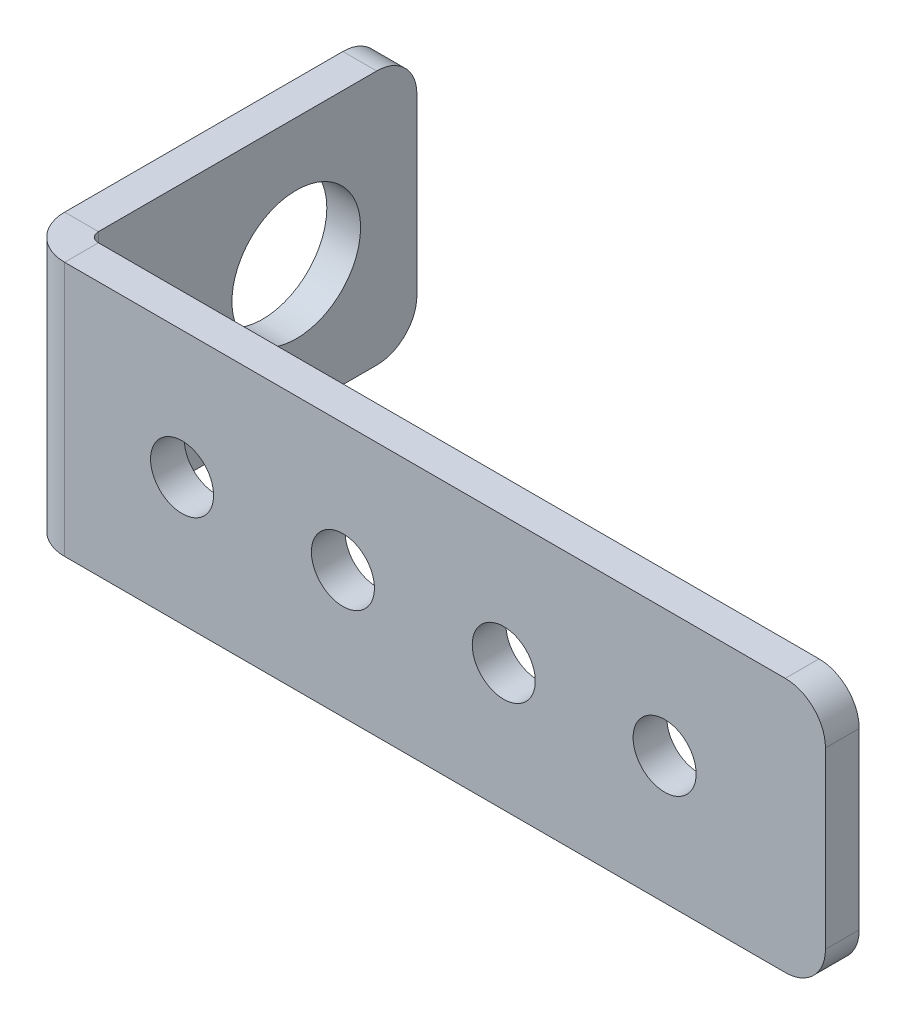
ISO-10303-21;
HEADER;
FILE_DESCRIPTION(('STEP AP214'),'2;1');
FILE_NAME('part.step','',(''),(''),'','','');
FILE_SCHEMA(('AUTOMOTIVE_DESIGN { 1 0 10303 214 1 1 1 1 }'));
ENDSEC;
DATA;
#1=APPLICATION_CONTEXT('core data for automotive mechanical design processes');
#2=APPLICATION_PROTOCOL_DEFINITION('international standard','automotive_design',2000,#1);
#3=PRODUCT_CONTEXT('',#1,'mechanical');
#4=PRODUCT('Part','Part','',(#3));
#5=PRODUCT_RELATED_PRODUCT_CATEGORY('part','',(#4));
#6=PRODUCT_DEFINITION_FORMATION('','',#4);
#7=PRODUCT_DEFINITION_CONTEXT('part definition',#1,'design');
#8=PRODUCT_DEFINITION('design','',#6,#7);
#9=PRODUCT_DEFINITION_SHAPE('','',#8);
#10=(LENGTH_UNIT() NAMED_UNIT(*) SI_UNIT(.MILLI.,.METRE.));
#11=(NAMED_UNIT(*) PLANE_ANGLE_UNIT() SI_UNIT($,.RADIAN.));
#12=(NAMED_UNIT(*) SI_UNIT($,.STERADIAN.) SOLID_ANGLE_UNIT());
#13=UNCERTAINTY_MEASURE_WITH_UNIT(LENGTH_MEASURE(1.E-05),#10,'distance_accuracy_value','');
#14=(GEOMETRIC_REPRESENTATION_CONTEXT(3) GLOBAL_UNCERTAINTY_ASSIGNED_CONTEXT((#13)) GLOBAL_UNIT_ASSIGNED_CONTEXT((#10,
#11,#12)) REPRESENTATION_CONTEXT('',''));
#15=CARTESIAN_POINT('',(0.,0.,0.));
#16=DIRECTION('',(0.,0.,1.));
#17=DIRECTION('',(1.,0.,0.));
#18=AXIS2_PLACEMENT_3D('',#15,#16,#17);
#19=CARTESIAN_POINT('',(0.,20.1168,-3.429));
#20=DIRECTION('',(0.,1.,0.));
#21=DIRECTION('',(0.,0.,1.));
#22=AXIS2_PLACEMENT_3D('',#19,#20,#21);
#23=PLANE('',#22);
#24=DIRECTION('',(1.,0.,0.));
#25=VECTOR('',#24,1.);
#26=CARTESIAN_POINT('',(0.,20.1168,-3.429));
#27=LINE('',#26,#25);
#28=CARTESIAN_POINT('',(0.,20.1168,-3.429));
#29=VERTEX_POINT('',#28);
#30=CARTESIAN_POINT('',(2.667,20.1168,-3.429));
#31=VERTEX_POINT('',#30);
#32=EDGE_CURVE('E146',#29,#31,#27,.T.);
#33=ORIENTED_EDGE('',*,*,#32,.F.);
#34=CARTESIAN_POINT('',(3.429,20.1168,-3.429));
#35=DIRECTION('',(0.,-1.,0.));
#36=DIRECTION('',(0.,0.,-1.));
#37=AXIS2_PLACEMENT_3D('',#34,#35,#36);
#38=CIRCLE('',#37,3.429);
#39=CARTESIAN_POINT('',(3.429,20.1168,0.));
#40=VERTEX_POINT('',#39);
#41=EDGE_CURVE('E141',#29,#40,#38,.F.);
#42=ORIENTED_EDGE('',*,*,#41,.T.);
#43=DIRECTION('',(0.,0.,1.));
#44=VECTOR('',#43,1.);
#45=CARTESIAN_POINT('',(3.429,20.1168,-2.667));
#46=LINE('',#45,#44);
#47=CARTESIAN_POINT('',(3.429,20.1168,-2.667));
#48=VERTEX_POINT('',#47);
#49=EDGE_CURVE('E135',#48,#40,#46,.T.);
#50=ORIENTED_EDGE('',*,*,#49,.F.);
#51=CARTESIAN_POINT('',(3.429,20.1168,-3.429));
#52=DIRECTION('',(0.,1.,0.));
#53=DIRECTION('',(1.,0.,0.));
#54=AXIS2_PLACEMENT_3D('',#51,#52,#53);
#55=CIRCLE('',#54,0.762);
#56=EDGE_CURVE('E139',#31,#48,#55,.T.);
#57=ORIENTED_EDGE('',*,*,#56,.F.);
#58=EDGE_LOOP('',(#33,#42,#50,#57));
#59=FACE_BOUND('',#58,.T.);
#60=ADVANCED_FACE('F45',(#59),#23,.T.);
#61=CARTESIAN_POINT('',(3.429,20.1168,-2.667));
#62=DIRECTION('',(0.,1.,0.));
#63=DIRECTION('',(0.,0.,1.));
#64=AXIS2_PLACEMENT_3D('',#61,#62,#63);
#65=PLANE('',#64);
#66=DIRECTION('',(0.,0.,-1.));
#67=VECTOR('',#66,1.);
#68=CARTESIAN_POINT('',(2.667,20.1168,0.));
#69=LINE('',#68,#67);
#70=CARTESIAN_POINT('',(2.667,20.1168,-25.4));
#71=VERTEX_POINT('',#70);
#72=EDGE_CURVE('E174',#71,#31,#69,.F.);
#73=ORIENTED_EDGE('',*,*,#72,.F.);
#74=DIRECTION('',(1.,0.,0.));
#75=VECTOR('',#74,1.);
#76=CARTESIAN_POINT('',(3.429,20.1168,-25.4));
#77=LINE('',#76,#75);
#78=CARTESIAN_POINT('',(0.,20.1168,-25.4));
#79=VERTEX_POINT('',#78);
#80=EDGE_CURVE('E11',#71,#79,#77,.F.);
#81=ORIENTED_EDGE('',*,*,#80,.T.);
#82=DIRECTION('',(0.,0.,1.));
#83=VECTOR('',#82,1.);
#84=CARTESIAN_POINT('',(0.,20.1168,0.));
#85=LINE('',#84,#83);
#86=EDGE_CURVE('E176',#79,#29,#85,.T.);
#87=ORIENTED_EDGE('',*,*,#86,.T.);
#88=ORIENTED_EDGE('',*,*,#32,.T.);
#89=EDGE_LOOP('',(#73,#81,#87,#88));
#90=FACE_BOUND('',#89,.T.);
#91=ADVANCED_FACE('F265',(#90),#65,.T.);
#92=CARTESIAN_POINT('',(3.429,0.,0.));
#93=DIRECTION('',(0.,-1.,0.));
#94=DIRECTION('',(0.,0.,-1.));
#95=AXIS2_PLACEMENT_3D('',#92,#93,#94);
#96=PLANE('',#95);
#97=DIRECTION('',(0.,0.,-1.));
#98=VECTOR('',#97,1.);
#99=CARTESIAN_POINT('',(3.429,0.,0.));
#100=LINE('',#99,#98);
#101=CARTESIAN_POINT('',(3.429,0.,0.));
#102=VERTEX_POINT('',#101);
#103=CARTESIAN_POINT('',(3.429,0.,-2.667));
#104=VERTEX_POINT('',#103);
#105=EDGE_CURVE('E147',#102,#104,#100,.T.);
#106=ORIENTED_EDGE('',*,*,#105,.F.);
#107=CARTESIAN_POINT('',(3.429,0.,-3.429));
#108=DIRECTION('',(0.,-1.,0.));
#109=DIRECTION('',(0.,0.,-1.));
#110=AXIS2_PLACEMENT_3D('',#107,#108,#109);
#111=CIRCLE('',#110,3.429);
#112=CARTESIAN_POINT('',(0.,0.,-3.429));
#113=VERTEX_POINT('',#112);
#114=EDGE_CURVE('E194',#113,#102,#111,.F.);
#115=ORIENTED_EDGE('',*,*,#114,.F.);
#116=DIRECTION('',(-1.,0.,0.));
#117=VECTOR('',#116,1.);
#118=CARTESIAN_POINT('',(2.667,0.,-3.429));
#119=LINE('',#118,#117);
#120=CARTESIAN_POINT('',(2.667,0.,-3.429));
#121=VERTEX_POINT('',#120);
#122=EDGE_CURVE('E211',#121,#113,#119,.T.);
#123=ORIENTED_EDGE('',*,*,#122,.F.);
#124=CARTESIAN_POINT('',(3.429,0.,-3.429));
#125=DIRECTION('',(0.,1.,0.));
#126=DIRECTION('',(1.,0.,0.));
#127=AXIS2_PLACEMENT_3D('',#124,#125,#126);
#128=CIRCLE('',#127,0.762);
#129=EDGE_CURVE('E188',#121,#104,#128,.T.);
#130=ORIENTED_EDGE('',*,*,#129,.T.);
#131=EDGE_LOOP('',(#106,#115,#123,#130));
#132=FACE_BOUND('',#131,.T.);
#133=ADVANCED_FACE('F329',(#132),#96,.T.);
#134=CARTESIAN_POINT('',(2.667,0.,-3.429));
#135=DIRECTION('',(0.,-1.,0.));
#136=DIRECTION('',(0.,0.,-1.));
#137=AXIS2_PLACEMENT_3D('',#134,#135,#136);
#138=PLANE('',#137);
#139=DIRECTION('',(1.,0.,0.));
#140=VECTOR('',#139,1.);
#141=CARTESIAN_POINT('',(0.,0.,-2.667));
#142=LINE('',#141,#140);
#143=CARTESIAN_POINT('',(60.325,0.,-2.667));
#144=VERTEX_POINT('',#143);
#145=EDGE_CURVE('E159',#104,#144,#142,.T.);
#146=ORIENTED_EDGE('',*,*,#145,.T.);
#147=DIRECTION('',(0.,0.,1.));
#148=VECTOR('',#147,1.);
#149=CARTESIAN_POINT('',(60.325,0.,-3.429));
#150=LINE('',#149,#148);
#151=CARTESIAN_POINT('',(60.325,0.,0.));
#152=VERTEX_POINT('',#151);
#153=EDGE_CURVE('E217',#144,#152,#150,.T.);
#154=ORIENTED_EDGE('',*,*,#153,.T.);
#155=DIRECTION('',(1.,0.,0.));
#156=VECTOR('',#155,1.);
#157=CARTESIAN_POINT('',(0.,0.,0.));
#158=LINE('',#157,#156);
#159=EDGE_CURVE('E183',#102,#152,#158,.T.);
#160=ORIENTED_EDGE('',*,*,#159,.F.);
#161=ORIENTED_EDGE('',*,*,#105,.T.);
#162=EDGE_LOOP('',(#146,#154,#160,#161));
#163=FACE_BOUND('',#162,.T.);
#164=ADVANCED_FACE('F496',(#163),#138,.T.);
#165=CARTESIAN_POINT('',(0.,20.1168,0.));
#166=DIRECTION('',(0.,0.,-1.));
#167=DIRECTION('',(-1.,0.,0.));
#168=AXIS2_PLACEMENT_3D('',#165,#166,#167);
#169=PLANE('',#168);
#170=CARTESIAN_POINT('',(50.8,10.0584,0.));
#171=DIRECTION('',(0.,0.,-1.));
#172=DIRECTION('',(-1.,0.,0.));
#173=AXIS2_PLACEMENT_3D('',#170,#171,#172);
#174=CIRCLE('',#173,2.4892);
#175=CARTESIAN_POINT('',(48.3108,10.0584,0.));
#176=VERTEX_POINT('',#175);
#177=EDGE_CURVE('E186',#176,#176,#174,.T.);
#178=ORIENTED_EDGE('',*,*,#177,.T.);
#179=EDGE_LOOP('',(#178));
#180=FACE_BOUND('',#179,.T.);
#181=CARTESIAN_POINT('',(38.1,10.0584,0.));
#182=DIRECTION('',(0.,0.,-1.));
#183=DIRECTION('',(-1.,0.,0.));
#184=AXIS2_PLACEMENT_3D('',#181,#182,#183);
#185=CIRCLE('',#184,2.4892);
#186=CARTESIAN_POINT('',(35.6108,10.0584,0.));
#187=VERTEX_POINT('',#186);
#188=EDGE_CURVE('E291',#187,#187,#185,.T.);
#189=ORIENTED_EDGE('',*,*,#188,.T.);
#190=EDGE_LOOP('',(#189));
#191=FACE_BOUND('',#190,.T.);
#192=CARTESIAN_POINT('',(25.4,10.0584,0.));
#193=DIRECTION('',(0.,0.,-1.));
#194=DIRECTION('',(-1.,0.,0.));
#195=AXIS2_PLACEMENT_3D('',#192,#193,#194);
#196=CIRCLE('',#195,2.4892);
#197=CARTESIAN_POINT('',(22.9108,10.0584,0.));
#198=VERTEX_POINT('',#197);
#199=EDGE_CURVE('E285',#198,#198,#196,.T.);
#200=ORIENTED_EDGE('',*,*,#199,.T.);
#201=EDGE_LOOP('',(#200));
#202=FACE_BOUND('',#201,.T.);
#203=CARTESIAN_POINT('',(12.7,10.0584,0.));
#204=DIRECTION('',(0.,0.,-1.));
#205=DIRECTION('',(-1.,0.,0.));
#206=AXIS2_PLACEMENT_3D('',#203,#204,#205);
#207=CIRCLE('',#206,2.4892);
#208=CARTESIAN_POINT('',(10.2108,10.0584,0.));
#209=VERTEX_POINT('',#208);
#210=EDGE_CURVE('E278',#209,#209,#207,.T.);
#211=ORIENTED_EDGE('',*,*,#210,.T.);
#212=EDGE_LOOP('',(#211));
#213=FACE_BOUND('',#212,.T.);
#214=ORIENTED_EDGE('',*,*,#159,.T.);
#215=CARTESIAN_POINT('',(60.325,3.175,0.));
#216=DIRECTION('',(0.,0.,-1.));
#217=DIRECTION('',(-1.,0.,0.));
#218=AXIS2_PLACEMENT_3D('',#215,#216,#217);
#219=CIRCLE('',#218,3.175);
#220=CARTESIAN_POINT('',(63.5,3.175,0.));
#221=VERTEX_POINT('',#220);
#222=EDGE_CURVE('E222',#152,#221,#219,.F.);
#223=ORIENTED_EDGE('',*,*,#222,.T.);
#224=DIRECTION('',(0.,-1.,0.));
#225=VECTOR('',#224,1.);
#226=CARTESIAN_POINT('',(63.5,20.1168,0.));
#227=LINE('',#226,#225);
#228=CARTESIAN_POINT('',(63.5,16.9418,0.));
#229=VERTEX_POINT('',#228);
#230=EDGE_CURVE('E208',#229,#221,#227,.T.);
#231=ORIENTED_EDGE('',*,*,#230,.F.);
#232=CARTESIAN_POINT('',(60.325,16.9418,0.));
#233=DIRECTION('',(0.,0.,-1.));
#234=DIRECTION('',(-1.,0.,0.));
#235=AXIS2_PLACEMENT_3D('',#232,#233,#234);
#236=CIRCLE('',#235,3.175);
#237=CARTESIAN_POINT('',(60.325,20.1168,0.));
#238=VERTEX_POINT('',#237);
#239=EDGE_CURVE('E220',#229,#238,#236,.F.);
#240=ORIENTED_EDGE('',*,*,#239,.T.);
#241=DIRECTION('',(1.,0.,0.));
#242=VECTOR('',#241,1.);
#243=CARTESIAN_POINT('',(0.,20.1168,0.));
#244=LINE('',#243,#242);
#245=EDGE_CURVE('E169',#40,#238,#244,.T.);
#246=ORIENTED_EDGE('',*,*,#245,.F.);
#247=DIRECTION('',(0.,-1.,0.));
#248=VECTOR('',#247,1.);
#249=CARTESIAN_POINT('',(3.429,20.1168,0.));
#250=LINE('',#249,#248);
#251=EDGE_CURVE('E182',#40,#102,#250,.T.);
#252=ORIENTED_EDGE('',*,*,#251,.T.);
#253=EDGE_LOOP('',(#214,#223,#231,#240,#246,#252));
#254=FACE_BOUND('',#253,.T.);
#255=ADVANCED_FACE('F272',(#180,#191,#202,#213,#254),#169,.F.);
#256=CARTESIAN_POINT('',(63.5,20.1168,-2.667));
#257=DIRECTION('',(1.,0.,0.));
#258=DIRECTION('',(0.,0.,-1.));
#259=AXIS2_PLACEMENT_3D('',#256,#257,#258);
#260=PLANE('',#259);
#261=ORIENTED_EDGE('',*,*,#230,.T.);
#262=DIRECTION('',(0.,0.,1.));
#263=VECTOR('',#262,1.);
#264=CARTESIAN_POINT('',(63.5,3.175,-2.667));
#265=LINE('',#264,#263);
#266=CARTESIAN_POINT('',(63.5,3.175,-2.667));
#267=VERTEX_POINT('',#266);
#268=EDGE_CURVE('E227',#221,#267,#265,.F.);
#269=ORIENTED_EDGE('',*,*,#268,.T.);
#270=DIRECTION('',(0.,-1.,0.));
#271=VECTOR('',#270,1.);
#272=CARTESIAN_POINT('',(63.5,20.1168,-2.667));
#273=LINE('',#272,#271);
#274=CARTESIAN_POINT('',(63.5,16.9418,-2.667));
#275=VERTEX_POINT('',#274);
#276=EDGE_CURVE('E163',#275,#267,#273,.T.);
#277=ORIENTED_EDGE('',*,*,#276,.F.);
#278=DIRECTION('',(0.,0.,1.));
#279=VECTOR('',#278,1.);
#280=CARTESIAN_POINT('',(63.5,16.9418,-2.667));
#281=LINE('',#280,#279);
#282=EDGE_CURVE('E224',#275,#229,#281,.T.);
#283=ORIENTED_EDGE('',*,*,#282,.T.);
#284=EDGE_LOOP('',(#261,#269,#277,#283));
#285=FACE_BOUND('',#284,.T.);
#286=ADVANCED_FACE('F475',(#285),#260,.T.);
#287=CARTESIAN_POINT('',(0.,20.1168,-2.667));
#288=DIRECTION('',(0.,0.,-1.));
#289=DIRECTION('',(-1.,0.,0.));
#290=AXIS2_PLACEMENT_3D('',#287,#288,#289);
#291=PLANE('',#290);
#292=CARTESIAN_POINT('',(50.8,10.0584,-2.667));
#293=DIRECTION('',(0.,0.,-1.));
#294=DIRECTION('',(-1.,0.,0.));
#295=AXIS2_PLACEMENT_3D('',#292,#293,#294);
#296=CIRCLE('',#295,2.4892);
#297=CARTESIAN_POINT('',(48.3108,10.0584,-2.667));
#298=VERTEX_POINT('',#297);
#299=EDGE_CURVE('E294',#298,#298,#296,.T.);
#300=ORIENTED_EDGE('',*,*,#299,.F.);
#301=EDGE_LOOP('',(#300));
#302=FACE_BOUND('',#301,.T.);
#303=CARTESIAN_POINT('',(38.1,10.0584,-2.667));
#304=DIRECTION('',(0.,0.,-1.));
#305=DIRECTION('',(-1.,0.,0.));
#306=AXIS2_PLACEMENT_3D('',#303,#304,#305);
#307=CIRCLE('',#306,2.4892);
#308=CARTESIAN_POINT('',(35.6108,10.0584,-2.667));
#309=VERTEX_POINT('',#308);
#310=EDGE_CURVE('E288',#309,#309,#307,.T.);
#311=ORIENTED_EDGE('',*,*,#310,.F.);
#312=EDGE_LOOP('',(#311));
#313=FACE_BOUND('',#312,.T.);
#314=CARTESIAN_POINT('',(25.4,10.0584,-2.667));
#315=DIRECTION('',(0.,0.,-1.));
#316=DIRECTION('',(-1.,0.,0.));
#317=AXIS2_PLACEMENT_3D('',#314,#315,#316);
#318=CIRCLE('',#317,2.4892);
#319=CARTESIAN_POINT('',(22.9108,10.0584,-2.667));
#320=VERTEX_POINT('',#319);
#321=EDGE_CURVE('E282',#320,#320,#318,.T.);
#322=ORIENTED_EDGE('',*,*,#321,.F.);
#323=EDGE_LOOP('',(#322));
#324=FACE_BOUND('',#323,.T.);
#325=CARTESIAN_POINT('',(12.7,10.0584,-2.667));
#326=DIRECTION('',(0.,0.,-1.));
#327=DIRECTION('',(-1.,0.,0.));
#328=AXIS2_PLACEMENT_3D('',#325,#326,#327);
#329=CIRCLE('',#328,2.4892);
#330=CARTESIAN_POINT('',(10.2108,10.0584,-2.667));
#331=VERTEX_POINT('',#330);
#332=EDGE_CURVE('E275',#331,#331,#329,.T.);
#333=ORIENTED_EDGE('',*,*,#332,.F.);
#334=EDGE_LOOP('',(#333));
#335=FACE_BOUND('',#334,.T.);
#336=ORIENTED_EDGE('',*,*,#276,.T.);
#337=CARTESIAN_POINT('',(60.325,3.175,-2.667));
#338=DIRECTION('',(0.,0.,-1.));
#339=DIRECTION('',(-1.,0.,0.));
#340=AXIS2_PLACEMENT_3D('',#337,#338,#339);
#341=CIRCLE('',#340,3.175);
#342=EDGE_CURVE('E231',#267,#144,#341,.T.);
#343=ORIENTED_EDGE('',*,*,#342,.T.);
#344=ORIENTED_EDGE('',*,*,#145,.F.);
#345=DIRECTION('',(0.,-1.,0.));
#346=VECTOR('',#345,1.);
#347=CARTESIAN_POINT('',(3.429,20.1168,-2.667));
#348=LINE('',#347,#346);
#349=EDGE_CURVE('E153',#48,#104,#348,.T.);
#350=ORIENTED_EDGE('',*,*,#349,.F.);
#351=DIRECTION('',(1.,0.,0.));
#352=VECTOR('',#351,1.);
#353=CARTESIAN_POINT('',(0.,20.1168,-2.667));
#354=LINE('',#353,#352);
#355=CARTESIAN_POINT('',(60.325,20.1168,-2.667));
#356=VERTEX_POINT('',#355);
#357=EDGE_CURVE('E156',#48,#356,#354,.T.);
#358=ORIENTED_EDGE('',*,*,#357,.T.);
#359=CARTESIAN_POINT('',(60.325,16.9418,-2.667));
#360=DIRECTION('',(0.,0.,-1.));
#361=DIRECTION('',(-1.,0.,0.));
#362=AXIS2_PLACEMENT_3D('',#359,#360,#361);
#363=CIRCLE('',#362,3.175);
#364=EDGE_CURVE('E229',#356,#275,#363,.T.);
#365=ORIENTED_EDGE('',*,*,#364,.T.);
#366=EDGE_LOOP('',(#336,#343,#344,#350,#358,#365));
#367=FACE_BOUND('',#366,.T.);
#368=ADVANCED_FACE('F155',(#302,#313,#324,#335,#367),#291,.T.);
#369=CARTESIAN_POINT('',(3.429,20.1168,-3.429));
#370=DIRECTION('',(0.,-1.,0.));
#371=DIRECTION('',(0.,0.,-1.));
#372=AXIS2_PLACEMENT_3D('',#369,#370,#371);
#373=CYLINDRICAL_SURFACE('',#372,0.762);
#374=ORIENTED_EDGE('',*,*,#129,.F.);
#375=DIRECTION('',(0.,-1.,0.));
#376=VECTOR('',#375,1.);
#377=CARTESIAN_POINT('',(2.667,20.1168,-3.429));
#378=LINE('',#377,#376);
#379=EDGE_CURVE('E164',#31,#121,#378,.T.);
#380=ORIENTED_EDGE('',*,*,#379,.F.);
#381=ORIENTED_EDGE('',*,*,#56,.T.);
#382=ORIENTED_EDGE('',*,*,#349,.T.);
#383=EDGE_LOOP('',(#374,#380,#381,#382));
#384=FACE_BOUND('',#383,.T.);
#385=ADVANCED_FACE('F172',(#384),#373,.F.);
#386=CARTESIAN_POINT('',(2.667,20.1168,0.));
#387=DIRECTION('',(1.,0.,0.));
#388=DIRECTION('',(0.,0.,-1.));
#389=AXIS2_PLACEMENT_3D('',#386,#387,#388);
#390=PLANE('',#389);
#391=CARTESIAN_POINT('',(2.667,10.0584,-19.05));
#392=DIRECTION('',(1.,0.,0.));
#393=DIRECTION('',(0.,0.,-1.));
#394=AXIS2_PLACEMENT_3D('',#391,#392,#393);
#395=CIRCLE('',#394,5.08);
#396=CARTESIAN_POINT('',(2.667,10.0584,-24.13));
#397=VERTEX_POINT('',#396);
#398=EDGE_CURVE('E299',#397,#397,#395,.T.);
#399=ORIENTED_EDGE('',*,*,#398,.F.);
#400=EDGE_LOOP('',(#399));
#401=FACE_BOUND('',#400,.T.);
#402=DIRECTION('',(0.,0.,-1.));
#403=VECTOR('',#402,1.);
#404=CARTESIAN_POINT('',(2.667,0.,0.));
#405=LINE('',#404,#403);
#406=CARTESIAN_POINT('',(2.667,0.,-25.4));
#407=VERTEX_POINT('',#406);
#408=EDGE_CURVE('E190',#407,#121,#405,.F.);
#409=ORIENTED_EDGE('',*,*,#408,.F.);
#410=CARTESIAN_POINT('',(2.667,3.175,-25.4));
#411=DIRECTION('',(1.,0.,0.));
#412=DIRECTION('',(0.,0.,-1.));
#413=AXIS2_PLACEMENT_3D('',#410,#411,#412);
#414=CIRCLE('',#413,3.175);
#415=CARTESIAN_POINT('',(2.667,3.175,-28.575));
#416=VERTEX_POINT('',#415);
#417=EDGE_CURVE('E239',#407,#416,#414,.T.);
#418=ORIENTED_EDGE('',*,*,#417,.T.);
#419=DIRECTION('',(0.,-1.,0.));
#420=VECTOR('',#419,1.);
#421=CARTESIAN_POINT('',(2.667,20.1168,-28.575));
#422=LINE('',#421,#420);
#423=CARTESIAN_POINT('',(2.667,16.9418,-28.575));
#424=VERTEX_POINT('',#423);
#425=EDGE_CURVE('E204',#424,#416,#422,.T.);
#426=ORIENTED_EDGE('',*,*,#425,.F.);
#427=CARTESIAN_POINT('',(2.667,16.9418,-25.4));
#428=DIRECTION('',(1.,0.,0.));
#429=DIRECTION('',(0.,0.,-1.));
#430=AXIS2_PLACEMENT_3D('',#427,#428,#429);
#431=CIRCLE('',#430,3.175);
#432=EDGE_CURVE('E237',#424,#71,#431,.T.);
#433=ORIENTED_EDGE('',*,*,#432,.T.);
#434=ORIENTED_EDGE('',*,*,#72,.T.);
#435=ORIENTED_EDGE('',*,*,#379,.T.);
#436=EDGE_LOOP('',(#409,#418,#426,#433,#434,#435));
#437=FACE_BOUND('',#436,.T.);
#438=ADVANCED_FACE('F260',(#401,#437),#390,.T.);
#439=CARTESIAN_POINT('',(0.,20.1168,-28.575));
#440=DIRECTION('',(0.,0.,-1.));
#441=DIRECTION('',(-1.,0.,0.));
#442=AXIS2_PLACEMENT_3D('',#439,#440,#441);
#443=PLANE('',#442);
#444=ORIENTED_EDGE('',*,*,#425,.T.);
#445=DIRECTION('',(1.,0.,0.));
#446=VECTOR('',#445,1.);
#447=CARTESIAN_POINT('',(0.,3.175,-28.575));
#448=LINE('',#447,#446);
#449=CARTESIAN_POINT('',(0.,3.175,-28.575));
#450=VERTEX_POINT('',#449);
#451=EDGE_CURVE('E66',#416,#450,#448,.F.);
#452=ORIENTED_EDGE('',*,*,#451,.T.);
#453=DIRECTION('',(0.,-1.,0.));
#454=VECTOR('',#453,1.);
#455=CARTESIAN_POINT('',(0.,20.1168,-28.575));
#456=LINE('',#455,#454);
#457=CARTESIAN_POINT('',(0.,16.9418,-28.575));
#458=VERTEX_POINT('',#457);
#459=EDGE_CURVE('E202',#458,#450,#456,.T.);
#460=ORIENTED_EDGE('',*,*,#459,.F.);
#461=DIRECTION('',(1.,0.,0.));
#462=VECTOR('',#461,1.);
#463=CARTESIAN_POINT('',(0.,16.9418,-28.575));
#464=LINE('',#463,#462);
#465=EDGE_CURVE('E241',#458,#424,#464,.T.);
#466=ORIENTED_EDGE('',*,*,#465,.T.);
#467=EDGE_LOOP('',(#444,#452,#460,#466));
#468=FACE_BOUND('',#467,.T.);
#469=ADVANCED_FACE('F261',(#468),#443,.T.);
#470=CARTESIAN_POINT('',(0.,20.1168,0.));
#471=DIRECTION('',(1.,0.,0.));
#472=DIRECTION('',(0.,0.,-1.));
#473=AXIS2_PLACEMENT_3D('',#470,#471,#472);
#474=PLANE('',#473);
#475=CARTESIAN_POINT('',(0.,10.0584,-19.05));
#476=DIRECTION('',(1.,0.,0.));
#477=DIRECTION('',(0.,0.,-1.));
#478=AXIS2_PLACEMENT_3D('',#475,#476,#477);
#479=CIRCLE('',#478,5.08);
#480=CARTESIAN_POINT('',(0.,10.0584,-24.13));
#481=VERTEX_POINT('',#480);
#482=EDGE_CURVE('E279',#481,#481,#479,.T.);
#483=ORIENTED_EDGE('',*,*,#482,.T.);
#484=EDGE_LOOP('',(#483));
#485=FACE_BOUND('',#484,.T.);
#486=ORIENTED_EDGE('',*,*,#459,.T.);
#487=CARTESIAN_POINT('',(0.,3.175,-25.4));
#488=DIRECTION('',(1.,0.,0.));
#489=DIRECTION('',(0.,0.,-1.));
#490=AXIS2_PLACEMENT_3D('',#487,#488,#489);
#491=CIRCLE('',#490,3.175);
#492=CARTESIAN_POINT('',(0.,0.,-25.4));
#493=VERTEX_POINT('',#492);
#494=EDGE_CURVE('E53',#450,#493,#491,.F.);
#495=ORIENTED_EDGE('',*,*,#494,.T.);
#496=DIRECTION('',(0.,0.,1.));
#497=VECTOR('',#496,1.);
#498=CARTESIAN_POINT('',(0.,0.,0.));
#499=LINE('',#498,#497);
#500=EDGE_CURVE('E192',#493,#113,#499,.T.);
#501=ORIENTED_EDGE('',*,*,#500,.T.);
#502=DIRECTION('',(0.,-1.,0.));
#503=VECTOR('',#502,1.);
#504=CARTESIAN_POINT('',(0.,20.1168,-3.429));
#505=LINE('',#504,#503);
#506=EDGE_CURVE('E199',#29,#113,#505,.T.);
#507=ORIENTED_EDGE('',*,*,#506,.F.);
#508=ORIENTED_EDGE('',*,*,#86,.F.);
#509=CARTESIAN_POINT('',(0.,16.9418,-25.4));
#510=DIRECTION('',(1.,0.,0.));
#511=DIRECTION('',(0.,0.,-1.));
#512=AXIS2_PLACEMENT_3D('',#509,#510,#511);
#513=CIRCLE('',#512,3.175);
#514=EDGE_CURVE('E245',#79,#458,#513,.F.);
#515=ORIENTED_EDGE('',*,*,#514,.T.);
#516=EDGE_LOOP('',(#486,#495,#501,#507,#508,#515));
#517=FACE_BOUND('',#516,.T.);
#518=ADVANCED_FACE('F249',(#485,#517),#474,.F.);
#519=CARTESIAN_POINT('',(3.429,20.1168,-3.429));
#520=DIRECTION('',(0.,-1.,0.));
#521=DIRECTION('',(0.,0.,-1.));
#522=AXIS2_PLACEMENT_3D('',#519,#520,#521);
#523=CYLINDRICAL_SURFACE('',#522,3.429);
#524=ORIENTED_EDGE('',*,*,#114,.T.);
#525=ORIENTED_EDGE('',*,*,#251,.F.);
#526=ORIENTED_EDGE('',*,*,#41,.F.);
#527=ORIENTED_EDGE('',*,*,#506,.T.);
#528=EDGE_LOOP('',(#524,#525,#526,#527));
#529=FACE_BOUND('',#528,.T.);
#530=ADVANCED_FACE('F268',(#529),#523,.T.);
#531=CARTESIAN_POINT('',(3.429,20.1168,-3.429));
#532=DIRECTION('',(0.,1.,0.));
#533=DIRECTION('',(1.,0.,0.));
#534=AXIS2_PLACEMENT_3D('',#531,#532,#533);
#535=PLANE('',#534);
#536=ORIENTED_EDGE('',*,*,#245,.T.);
#537=DIRECTION('',(0.,0.,1.));
#538=VECTOR('',#537,1.);
#539=CARTESIAN_POINT('',(60.325,20.1168,-3.429));
#540=LINE('',#539,#538);
#541=EDGE_CURVE('E168',#238,#356,#540,.F.);
#542=ORIENTED_EDGE('',*,*,#541,.T.);
#543=ORIENTED_EDGE('',*,*,#357,.F.);
#544=ORIENTED_EDGE('',*,*,#49,.T.);
#545=EDGE_LOOP('',(#536,#542,#543,#544));
#546=FACE_BOUND('',#545,.T.);
#547=ADVANCED_FACE('F166',(#546),#535,.T.);
#548=CARTESIAN_POINT('',(3.429,0.,-3.429));
#549=DIRECTION('',(0.,1.,0.));
#550=DIRECTION('',(1.,0.,0.));
#551=AXIS2_PLACEMENT_3D('',#548,#549,#550);
#552=PLANE('',#551);
#553=ORIENTED_EDGE('',*,*,#500,.F.);
#554=DIRECTION('',(1.,0.,0.));
#555=VECTOR('',#554,1.);
#556=CARTESIAN_POINT('',(2.667,0.,-25.4));
#557=LINE('',#556,#555);
#558=EDGE_CURVE('E234',#493,#407,#557,.T.);
#559=ORIENTED_EDGE('',*,*,#558,.T.);
#560=ORIENTED_EDGE('',*,*,#408,.T.);
#561=ORIENTED_EDGE('',*,*,#122,.T.);
#562=EDGE_LOOP('',(#553,#559,#560,#561));
#563=FACE_BOUND('',#562,.T.);
#564=ADVANCED_FACE('F254',(#563),#552,.F.);
#565=CARTESIAN_POINT('',(12.7,10.0584,0.));
#566=DIRECTION('',(0.,0.,-1.));
#567=DIRECTION('',(-1.,0.,0.));
#568=AXIS2_PLACEMENT_3D('',#565,#566,#567);
#569=CYLINDRICAL_SURFACE('',#568,2.4892);
#570=ORIENTED_EDGE('',*,*,#210,.F.);
#571=EDGE_LOOP('',(#570));
#572=FACE_BOUND('',#571,.T.);
#573=ORIENTED_EDGE('',*,*,#332,.T.);
#574=EDGE_LOOP('',(#573));
#575=FACE_BOUND('',#574,.T.);
#576=ADVANCED_FACE('F401',(#572,#575),#569,.F.);
#577=CARTESIAN_POINT('',(25.4,10.0584,0.));
#578=DIRECTION('',(0.,0.,-1.));
#579=DIRECTION('',(-1.,0.,0.));
#580=AXIS2_PLACEMENT_3D('',#577,#578,#579);
#581=CYLINDRICAL_SURFACE('',#580,2.4892);
#582=ORIENTED_EDGE('',*,*,#199,.F.);
#583=EDGE_LOOP('',(#582));
#584=FACE_BOUND('',#583,.T.);
#585=ORIENTED_EDGE('',*,*,#321,.T.);
#586=EDGE_LOOP('',(#585));
#587=FACE_BOUND('',#586,.T.);
#588=ADVANCED_FACE('F390',(#584,#587),#581,.F.);
#589=CARTESIAN_POINT('',(38.1,10.0584,0.));
#590=DIRECTION('',(0.,0.,-1.));
#591=DIRECTION('',(-1.,0.,0.));
#592=AXIS2_PLACEMENT_3D('',#589,#590,#591);
#593=CYLINDRICAL_SURFACE('',#592,2.4892);
#594=ORIENTED_EDGE('',*,*,#188,.F.);
#595=EDGE_LOOP('',(#594));
#596=FACE_BOUND('',#595,.T.);
#597=ORIENTED_EDGE('',*,*,#310,.T.);
#598=EDGE_LOOP('',(#597));
#599=FACE_BOUND('',#598,.T.);
#600=ADVANCED_FACE('F379',(#596,#599),#593,.F.);
#601=CARTESIAN_POINT('',(50.8,10.0584,0.));
#602=DIRECTION('',(0.,0.,-1.));
#603=DIRECTION('',(-1.,0.,0.));
#604=AXIS2_PLACEMENT_3D('',#601,#602,#603);
#605=CYLINDRICAL_SURFACE('',#604,2.4892);
#606=ORIENTED_EDGE('',*,*,#177,.F.);
#607=EDGE_LOOP('',(#606));
#608=FACE_BOUND('',#607,.T.);
#609=ORIENTED_EDGE('',*,*,#299,.T.);
#610=EDGE_LOOP('',(#609));
#611=FACE_BOUND('',#610,.T.);
#612=ADVANCED_FACE('F310',(#608,#611),#605,.F.);
#613=CARTESIAN_POINT('',(0.,10.0584,-19.05));
#614=DIRECTION('',(1.,0.,0.));
#615=DIRECTION('',(0.,0.,-1.));
#616=AXIS2_PLACEMENT_3D('',#613,#614,#615);
#617=CYLINDRICAL_SURFACE('',#616,5.08);
#618=ORIENTED_EDGE('',*,*,#482,.F.);
#619=EDGE_LOOP('',(#618));
#620=FACE_BOUND('',#619,.T.);
#621=ORIENTED_EDGE('',*,*,#398,.T.);
#622=EDGE_LOOP('',(#621));
#623=FACE_BOUND('',#622,.T.);
#624=ADVANCED_FACE('F306',(#620,#623),#617,.F.);
#625=CARTESIAN_POINT('',(60.325,3.175,-3.429));
#626=DIRECTION('',(0.,0.,1.));
#627=DIRECTION('',(1.,0.,0.));
#628=AXIS2_PLACEMENT_3D('',#625,#626,#627);
#629=CYLINDRICAL_SURFACE('',#628,3.175);
#630=ORIENTED_EDGE('',*,*,#342,.F.);
#631=ORIENTED_EDGE('',*,*,#268,.F.);
#632=ORIENTED_EDGE('',*,*,#222,.F.);
#633=ORIENTED_EDGE('',*,*,#153,.F.);
#634=EDGE_LOOP('',(#630,#631,#632,#633));
#635=FACE_BOUND('',#634,.T.);
#636=ADVANCED_FACE('F309',(#635),#629,.T.);
#637=CARTESIAN_POINT('',(60.325,16.9418,-2.667));
#638=DIRECTION('',(0.,0.,1.));
#639=DIRECTION('',(1.,0.,0.));
#640=AXIS2_PLACEMENT_3D('',#637,#638,#639);
#641=CYLINDRICAL_SURFACE('',#640,3.175);
#642=ORIENTED_EDGE('',*,*,#364,.F.);
#643=ORIENTED_EDGE('',*,*,#541,.F.);
#644=ORIENTED_EDGE('',*,*,#239,.F.);
#645=ORIENTED_EDGE('',*,*,#282,.F.);
#646=EDGE_LOOP('',(#642,#643,#644,#645));
#647=FACE_BOUND('',#646,.T.);
#648=ADVANCED_FACE('F335',(#647),#641,.T.);
#649=CARTESIAN_POINT('',(3.429,3.175,-25.4));
#650=DIRECTION('',(-1.,0.,0.));
#651=DIRECTION('',(0.,0.,1.));
#652=AXIS2_PLACEMENT_3D('',#649,#650,#651);
#653=CYLINDRICAL_SURFACE('',#652,3.175);
#654=ORIENTED_EDGE('',*,*,#494,.F.);
#655=ORIENTED_EDGE('',*,*,#451,.F.);
#656=ORIENTED_EDGE('',*,*,#417,.F.);
#657=ORIENTED_EDGE('',*,*,#558,.F.);
#658=EDGE_LOOP('',(#654,#655,#656,#657));
#659=FACE_BOUND('',#658,.T.);
#660=ADVANCED_FACE('F257',(#659),#653,.T.);
#661=CARTESIAN_POINT('',(0.,16.9418,-25.4));
#662=DIRECTION('',(1.,0.,0.));
#663=DIRECTION('',(0.,0.,-1.));
#664=AXIS2_PLACEMENT_3D('',#661,#662,#663);
#665=CYLINDRICAL_SURFACE('',#664,3.175);
#666=ORIENTED_EDGE('',*,*,#514,.F.);
#667=ORIENTED_EDGE('',*,*,#80,.F.);
#668=ORIENTED_EDGE('',*,*,#432,.F.);
#669=ORIENTED_EDGE('',*,*,#465,.F.);
#670=EDGE_LOOP('',(#666,#667,#668,#669));
#671=FACE_BOUND('',#670,.T.);
#672=ADVANCED_FACE('F47',(#671),#665,.T.);
#673=CLOSED_SHELL('',(#60,#91,#133,#164,#255,#286,#368,#385,#438,#469,#518,#530,#547,#564,#576,
#588,#600,#612,#624,#636,#648,#660,#672));
#674=MANIFOLD_SOLID_BREP('B2',#673);
#675=ADVANCED_BREP_SHAPE_REPRESENTATION('',(#18,#674),#14);
#676=SHAPE_DEFINITION_REPRESENTATION(#9,#675);
ENDSEC;
END-ISO-10303-21;
